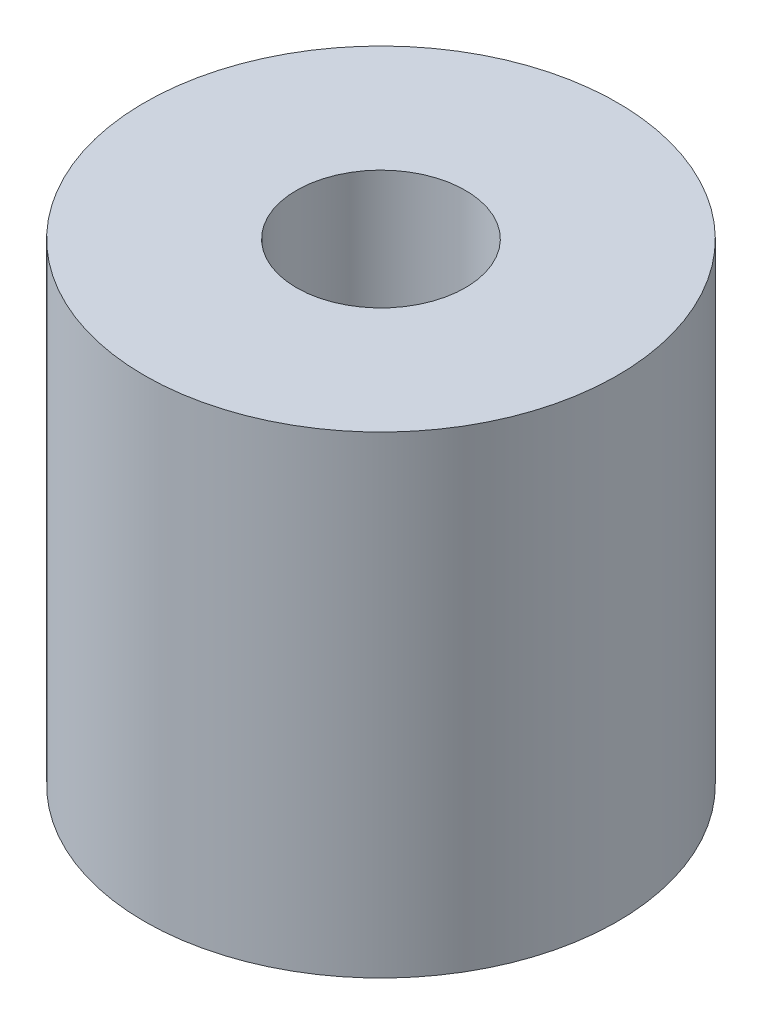
ISO-10303-21;
HEADER;
FILE_DESCRIPTION(('STEP AP214'),'2;1');
FILE_NAME('part.step','',(''),(''),'','','');
FILE_SCHEMA(('AUTOMOTIVE_DESIGN { 1 0 10303 214 1 1 1 1 }'));
ENDSEC;
DATA;
#1=APPLICATION_CONTEXT('core data for automotive mechanical design processes');
#2=APPLICATION_PROTOCOL_DEFINITION('international standard','automotive_design',2000,#1);
#3=PRODUCT_CONTEXT('',#1,'mechanical');
#4=PRODUCT('Part','Part','',(#3));
#5=PRODUCT_RELATED_PRODUCT_CATEGORY('part','',(#4));
#6=PRODUCT_DEFINITION_FORMATION('','',#4);
#7=PRODUCT_DEFINITION_CONTEXT('part definition',#1,'design');
#8=PRODUCT_DEFINITION('design','',#6,#7);
#9=PRODUCT_DEFINITION_SHAPE('','',#8);
#10=(LENGTH_UNIT() NAMED_UNIT(*) SI_UNIT(.MILLI.,.METRE.));
#11=(NAMED_UNIT(*) PLANE_ANGLE_UNIT() SI_UNIT($,.RADIAN.));
#12=(NAMED_UNIT(*) SI_UNIT($,.STERADIAN.) SOLID_ANGLE_UNIT());
#13=UNCERTAINTY_MEASURE_WITH_UNIT(LENGTH_MEASURE(1.E-05),#10,'distance_accuracy_value','');
#14=(GEOMETRIC_REPRESENTATION_CONTEXT(3) GLOBAL_UNCERTAINTY_ASSIGNED_CONTEXT((#13)) GLOBAL_UNIT_ASSIGNED_CONTEXT((#10,
#11,#12)) REPRESENTATION_CONTEXT('',''));
#15=CARTESIAN_POINT('',(0.,0.,0.));
#16=DIRECTION('',(0.,0.,1.));
#17=DIRECTION('',(1.,0.,0.));
#18=AXIS2_PLACEMENT_3D('',#15,#16,#17);
#19=CARTESIAN_POINT('',(0.,14.,0.));
#20=DIRECTION('',(0.,1.,0.));
#21=DIRECTION('',(0.,0.,1.));
#22=AXIS2_PLACEMENT_3D('',#19,#20,#21);
#23=PLANE('',#22);
#24=CARTESIAN_POINT('',(0.,14.,0.));
#25=DIRECTION('',(0.,1.,0.));
#26=DIRECTION('',(0.,0.,1.));
#27=AXIS2_PLACEMENT_3D('',#24,#25,#26);
#28=CIRCLE('',#27,7.);
#29=CARTESIAN_POINT('',(0.,14.,7.));
#30=VERTEX_POINT('',#29);
#31=EDGE_CURVE('E10',#30,#30,#28,.T.);
#32=ORIENTED_EDGE('',*,*,#31,.T.);
#33=EDGE_LOOP('',(#32));
#34=FACE_BOUND('',#33,.T.);
#35=CARTESIAN_POINT('',(0.,14.,0.));
#36=DIRECTION('',(0.,1.,0.));
#37=DIRECTION('',(0.,0.,1.));
#38=AXIS2_PLACEMENT_3D('',#35,#36,#37);
#39=CIRCLE('',#38,2.5);
#40=CARTESIAN_POINT('',(0.,14.,2.5));
#41=VERTEX_POINT('',#40);
#42=EDGE_CURVE('E42',#41,#41,#39,.T.);
#43=ORIENTED_EDGE('',*,*,#42,.F.);
#44=EDGE_LOOP('',(#43));
#45=FACE_BOUND('',#44,.T.);
#46=ADVANCED_FACE('F31',(#34,#45),#23,.T.);
#47=CARTESIAN_POINT('',(0.,0.,0.));
#48=DIRECTION('',(0.,1.,0.));
#49=DIRECTION('',(0.,0.,1.));
#50=AXIS2_PLACEMENT_3D('',#47,#48,#49);
#51=PLANE('',#50);
#52=CARTESIAN_POINT('',(0.,0.,0.));
#53=DIRECTION('',(0.,1.,0.));
#54=DIRECTION('',(0.,0.,1.));
#55=AXIS2_PLACEMENT_3D('',#52,#53,#54);
#56=CIRCLE('',#55,7.);
#57=CARTESIAN_POINT('',(0.,0.,7.));
#58=VERTEX_POINT('',#57);
#59=EDGE_CURVE('E35',#58,#58,#56,.T.);
#60=ORIENTED_EDGE('',*,*,#59,.F.);
#61=EDGE_LOOP('',(#60));
#62=FACE_BOUND('',#61,.T.);
#63=CARTESIAN_POINT('',(0.,0.,0.));
#64=DIRECTION('',(0.,1.,0.));
#65=DIRECTION('',(0.,0.,1.));
#66=AXIS2_PLACEMENT_3D('',#63,#64,#65);
#67=CIRCLE('',#66,2.5);
#68=CARTESIAN_POINT('',(0.,0.,2.5));
#69=VERTEX_POINT('',#68);
#70=EDGE_CURVE('E44',#69,#69,#67,.T.);
#71=ORIENTED_EDGE('',*,*,#70,.T.);
#72=EDGE_LOOP('',(#71));
#73=FACE_BOUND('',#72,.T.);
#74=ADVANCED_FACE('F54',(#62,#73),#51,.F.);
#75=CARTESIAN_POINT('',(0.,14.,0.));
#76=DIRECTION('',(0.,-1.,0.));
#77=DIRECTION('',(0.,0.,-1.));
#78=AXIS2_PLACEMENT_3D('',#75,#76,#77);
#79=CYLINDRICAL_SURFACE('',#78,7.);
#80=ORIENTED_EDGE('',*,*,#31,.F.);
#81=EDGE_LOOP('',(#80));
#82=FACE_BOUND('',#81,.T.);
#83=ORIENTED_EDGE('',*,*,#59,.T.);
#84=EDGE_LOOP('',(#83));
#85=FACE_BOUND('',#84,.T.);
#86=ADVANCED_FACE('F33',(#82,#85),#79,.T.);
#87=CARTESIAN_POINT('',(0.,14.,0.));
#88=DIRECTION('',(0.,-1.,0.));
#89=DIRECTION('',(0.,0.,-1.));
#90=AXIS2_PLACEMENT_3D('',#87,#88,#89);
#91=CYLINDRICAL_SURFACE('',#90,2.5);
#92=ORIENTED_EDGE('',*,*,#42,.T.);
#93=EDGE_LOOP('',(#92));
#94=FACE_BOUND('',#93,.T.);
#95=ORIENTED_EDGE('',*,*,#70,.F.);
#96=EDGE_LOOP('',(#95));
#97=FACE_BOUND('',#96,.T.);
#98=ADVANCED_FACE('F50',(#94,#97),#91,.F.);
#99=CLOSED_SHELL('',(#46,#74,#86,#98));
#100=MANIFOLD_SOLID_BREP('B2',#99);
#101=ADVANCED_BREP_SHAPE_REPRESENTATION('',(#18,#100),#14);
#102=SHAPE_DEFINITION_REPRESENTATION(#9,#101);
ENDSEC;
END-ISO-10303-21;
